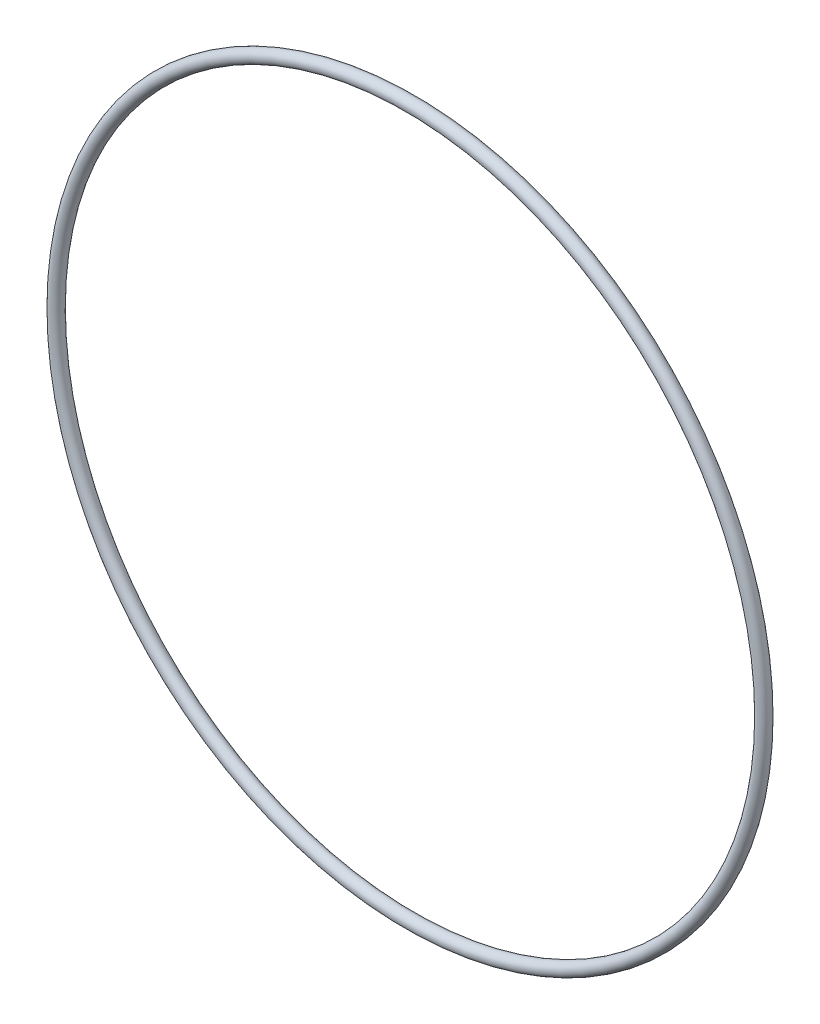
ISO-10303-21;
HEADER;
FILE_DESCRIPTION(('STEP AP214'),'2;1');
FILE_NAME('part.step','',(''),(''),'','','');
FILE_SCHEMA(('AUTOMOTIVE_DESIGN { 1 0 10303 214 1 1 1 1 }'));
ENDSEC;
DATA;
#1=APPLICATION_CONTEXT('core data for automotive mechanical design processes');
#2=APPLICATION_PROTOCOL_DEFINITION('international standard','automotive_design',2000,#1);
#3=PRODUCT_CONTEXT('',#1,'mechanical');
#4=PRODUCT('Part','Part','',(#3));
#5=PRODUCT_RELATED_PRODUCT_CATEGORY('part','',(#4));
#6=PRODUCT_DEFINITION_FORMATION('','',#4);
#7=PRODUCT_DEFINITION_CONTEXT('part definition',#1,'design');
#8=PRODUCT_DEFINITION('design','',#6,#7);
#9=PRODUCT_DEFINITION_SHAPE('','',#8);
#10=(LENGTH_UNIT() NAMED_UNIT(*) SI_UNIT(.MILLI.,.METRE.));
#11=(NAMED_UNIT(*) PLANE_ANGLE_UNIT() SI_UNIT($,.RADIAN.));
#12=(NAMED_UNIT(*) SI_UNIT($,.STERADIAN.) SOLID_ANGLE_UNIT());
#13=UNCERTAINTY_MEASURE_WITH_UNIT(LENGTH_MEASURE(1.E-05),#10,'distance_accuracy_value','');
#14=(GEOMETRIC_REPRESENTATION_CONTEXT(3) GLOBAL_UNCERTAINTY_ASSIGNED_CONTEXT((#13)) GLOBAL_UNIT_ASSIGNED_CONTEXT((#10,
#11,#12)) REPRESENTATION_CONTEXT('',''));
#15=CARTESIAN_POINT('',(0.,0.,0.));
#16=DIRECTION('',(0.,0.,1.));
#17=DIRECTION('',(1.,0.,0.));
#18=AXIS2_PLACEMENT_3D('',#15,#16,#17);
#19=CARTESIAN_POINT('',(0.,0.,0.));
#20=DIRECTION('',(0.,0.,1.));
#21=DIRECTION('',(1.,0.,0.));
#22=AXIS2_PLACEMENT_3D('',#19,#20,#21);
#23=TOROIDAL_SURFACE('',#22,48.3743,0.889000000000003);
#24=CARTESIAN_POINT('',(49.2633,0.,0.));
#25=VERTEX_POINT('',#24);
#26=VERTEX_LOOP('',#25);
#27=FACE_BOUND('',#26,.T.);
#28=ADVANCED_FACE('F30',(#27),#23,.T.);
#29=CLOSED_SHELL('',(#28));
#30=MANIFOLD_SOLID_BREP('B2',#29);
#31=ADVANCED_BREP_SHAPE_REPRESENTATION('',(#18,#30),#14);
#32=SHAPE_DEFINITION_REPRESENTATION(#9,#31);
ENDSEC;
END-ISO-10303-21;
